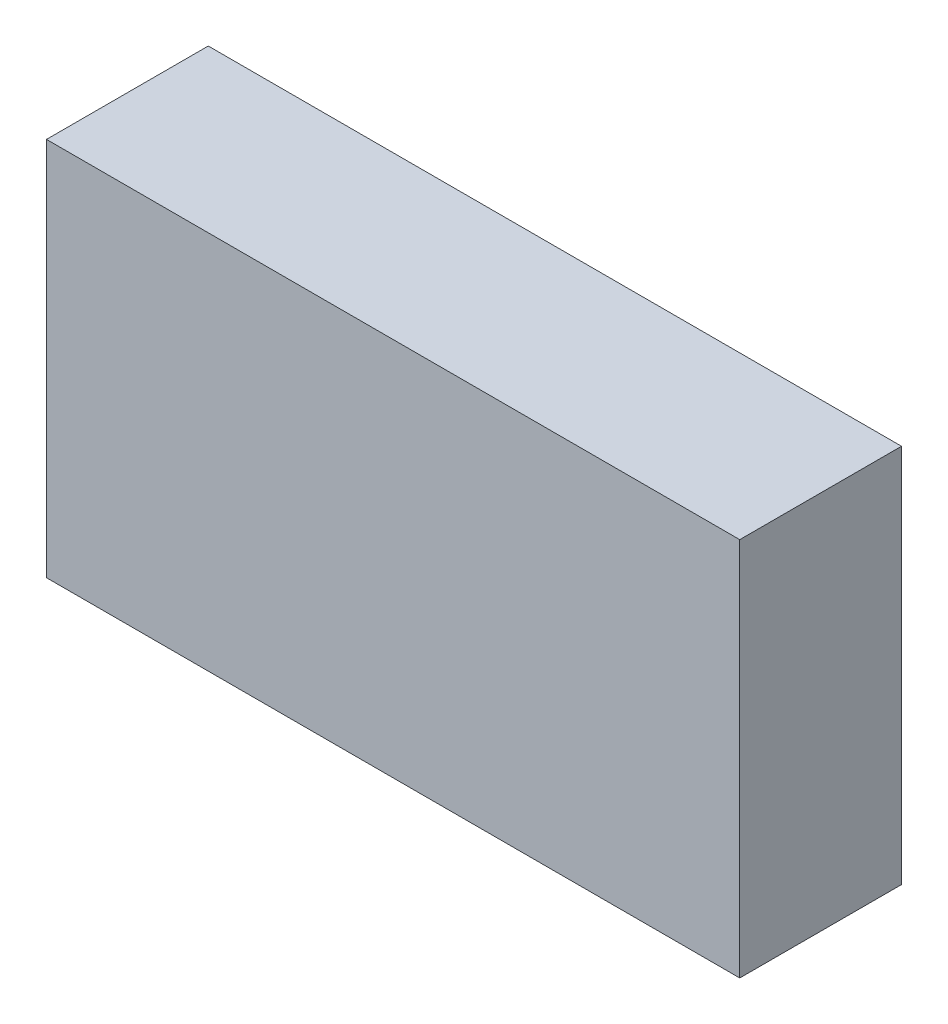
ISO-10303-21;
HEADER;
FILE_DESCRIPTION(('STEP AP214'),'2;1');
FILE_NAME('part.step','',(''),(''),'','','');
FILE_SCHEMA(('AUTOMOTIVE_DESIGN { 1 0 10303 214 1 1 1 1 }'));
ENDSEC;
DATA;
#1=APPLICATION_CONTEXT('core data for automotive mechanical design processes');
#2=APPLICATION_PROTOCOL_DEFINITION('international standard','automotive_design',2000,#1);
#3=PRODUCT_CONTEXT('',#1,'mechanical');
#4=PRODUCT('Part','Part','',(#3));
#5=PRODUCT_RELATED_PRODUCT_CATEGORY('part','',(#4));
#6=PRODUCT_DEFINITION_FORMATION('','',#4);
#7=PRODUCT_DEFINITION_CONTEXT('part definition',#1,'design');
#8=PRODUCT_DEFINITION('design','',#6,#7);
#9=PRODUCT_DEFINITION_SHAPE('','',#8);
#10=(LENGTH_UNIT() NAMED_UNIT(*) SI_UNIT(.MILLI.,.METRE.));
#11=(NAMED_UNIT(*) PLANE_ANGLE_UNIT() SI_UNIT($,.RADIAN.));
#12=(NAMED_UNIT(*) SI_UNIT($,.STERADIAN.) SOLID_ANGLE_UNIT());
#13=UNCERTAINTY_MEASURE_WITH_UNIT(LENGTH_MEASURE(1.E-05),#10,'distance_accuracy_value','');
#14=(GEOMETRIC_REPRESENTATION_CONTEXT(3) GLOBAL_UNCERTAINTY_ASSIGNED_CONTEXT((#13)) GLOBAL_UNIT_ASSIGNED_CONTEXT((#10,
#11,#12)) REPRESENTATION_CONTEXT('',''));
#15=CARTESIAN_POINT('',(0.,0.,0.));
#16=DIRECTION('',(0.,0.,1.));
#17=DIRECTION('',(1.,0.,0.));
#18=AXIS2_PLACEMENT_3D('',#15,#16,#17);
#19=CARTESIAN_POINT('',(105.,-57.5,49.));
#20=DIRECTION('',(-1.,0.,0.));
#21=DIRECTION('',(0.,0.,1.));
#22=AXIS2_PLACEMENT_3D('',#19,#20,#21);
#23=PLANE('',#22);
#24=DIRECTION('',(0.,1.,0.));
#25=VECTOR('',#24,1.);
#26=CARTESIAN_POINT('',(105.,-57.5,0.));
#27=LINE('',#26,#25);
#28=CARTESIAN_POINT('',(105.,-57.5,0.));
#29=VERTEX_POINT('',#28);
#30=CARTESIAN_POINT('',(105.,57.5,0.));
#31=VERTEX_POINT('',#30);
#32=EDGE_CURVE('E97',#29,#31,#27,.T.);
#33=ORIENTED_EDGE('',*,*,#32,.T.);
#34=DIRECTION('',(0.,0.,-1.));
#35=VECTOR('',#34,1.);
#36=CARTESIAN_POINT('',(105.,57.5,49.));
#37=LINE('',#36,#35);
#38=CARTESIAN_POINT('',(105.,57.5,49.));
#39=VERTEX_POINT('',#38);
#40=EDGE_CURVE('E11',#39,#31,#37,.T.);
#41=ORIENTED_EDGE('',*,*,#40,.F.);
#42=DIRECTION('',(0.,1.,0.));
#43=VECTOR('',#42,1.);
#44=CARTESIAN_POINT('',(105.,-57.5,49.));
#45=LINE('',#44,#43);
#46=CARTESIAN_POINT('',(105.,-57.5,49.));
#47=VERTEX_POINT('',#46);
#48=EDGE_CURVE('E85',#47,#39,#45,.T.);
#49=ORIENTED_EDGE('',*,*,#48,.F.);
#50=DIRECTION('',(0.,0.,-1.));
#51=VECTOR('',#50,1.);
#52=CARTESIAN_POINT('',(105.,-57.5,49.));
#53=LINE('',#52,#51);
#54=EDGE_CURVE('E93',#47,#29,#53,.T.);
#55=ORIENTED_EDGE('',*,*,#54,.T.);
#56=EDGE_LOOP('',(#33,#41,#49,#55));
#57=FACE_BOUND('',#56,.T.);
#58=ADVANCED_FACE('F34',(#57),#23,.F.);
#59=CARTESIAN_POINT('',(-105.,57.5,49.));
#60=DIRECTION('',(0.,-1.,0.));
#61=DIRECTION('',(0.,0.,-1.));
#62=AXIS2_PLACEMENT_3D('',#59,#60,#61);
#63=PLANE('',#62);
#64=DIRECTION('',(-1.,0.,0.));
#65=VECTOR('',#64,1.);
#66=CARTESIAN_POINT('',(-105.,57.5,0.));
#67=LINE('',#66,#65);
#68=CARTESIAN_POINT('',(-105.,57.5,0.));
#69=VERTEX_POINT('',#68);
#70=EDGE_CURVE('E89',#31,#69,#67,.T.);
#71=ORIENTED_EDGE('',*,*,#70,.T.);
#72=DIRECTION('',(0.,0.,-1.));
#73=VECTOR('',#72,1.);
#74=CARTESIAN_POINT('',(-105.,57.5,49.));
#75=LINE('',#74,#73);
#76=CARTESIAN_POINT('',(-105.,57.5,49.));
#77=VERTEX_POINT('',#76);
#78=EDGE_CURVE('E42',#77,#69,#75,.T.);
#79=ORIENTED_EDGE('',*,*,#78,.F.);
#80=DIRECTION('',(-1.,0.,0.));
#81=VECTOR('',#80,1.);
#82=CARTESIAN_POINT('',(-105.,57.5,49.));
#83=LINE('',#82,#81);
#84=EDGE_CURVE('E80',#39,#77,#83,.T.);
#85=ORIENTED_EDGE('',*,*,#84,.F.);
#86=ORIENTED_EDGE('',*,*,#40,.T.);
#87=EDGE_LOOP('',(#71,#79,#85,#86));
#88=FACE_BOUND('',#87,.T.);
#89=ADVANCED_FACE('F88',(#88),#63,.F.);
#90=CARTESIAN_POINT('',(-105.,-57.5,49.));
#91=DIRECTION('',(1.,0.,0.));
#92=DIRECTION('',(0.,0.,-1.));
#93=AXIS2_PLACEMENT_3D('',#90,#91,#92);
#94=PLANE('',#93);
#95=DIRECTION('',(0.,-1.,0.));
#96=VECTOR('',#95,1.);
#97=CARTESIAN_POINT('',(-105.,-57.5,0.));
#98=LINE('',#97,#96);
#99=CARTESIAN_POINT('',(-105.,-57.5,0.));
#100=VERTEX_POINT('',#99);
#101=EDGE_CURVE('E67',#69,#100,#98,.T.);
#102=ORIENTED_EDGE('',*,*,#101,.T.);
#103=DIRECTION('',(0.,0.,-1.));
#104=VECTOR('',#103,1.);
#105=CARTESIAN_POINT('',(-105.,-57.5,49.));
#106=LINE('',#105,#104);
#107=CARTESIAN_POINT('',(-105.,-57.5,49.));
#108=VERTEX_POINT('',#107);
#109=EDGE_CURVE('E90',#108,#100,#106,.T.);
#110=ORIENTED_EDGE('',*,*,#109,.F.);
#111=DIRECTION('',(0.,-1.,0.));
#112=VECTOR('',#111,1.);
#113=CARTESIAN_POINT('',(-105.,-57.5,49.));
#114=LINE('',#113,#112);
#115=EDGE_CURVE('E83',#77,#108,#114,.T.);
#116=ORIENTED_EDGE('',*,*,#115,.F.);
#117=ORIENTED_EDGE('',*,*,#78,.T.);
#118=EDGE_LOOP('',(#102,#110,#116,#117));
#119=FACE_BOUND('',#118,.T.);
#120=ADVANCED_FACE('F91',(#119),#94,.F.);
#121=CARTESIAN_POINT('',(-105.,-57.5,49.));
#122=DIRECTION('',(0.,1.,0.));
#123=DIRECTION('',(0.,0.,1.));
#124=AXIS2_PLACEMENT_3D('',#121,#122,#123);
#125=PLANE('',#124);
#126=DIRECTION('',(1.,0.,0.));
#127=VECTOR('',#126,1.);
#128=CARTESIAN_POINT('',(-105.,-57.5,0.));
#129=LINE('',#128,#127);
#130=EDGE_CURVE('E73',#100,#29,#129,.T.);
#131=ORIENTED_EDGE('',*,*,#130,.T.);
#132=ORIENTED_EDGE('',*,*,#54,.F.);
#133=DIRECTION('',(1.,0.,0.));
#134=VECTOR('',#133,1.);
#135=CARTESIAN_POINT('',(-105.,-57.5,49.));
#136=LINE('',#135,#134);
#137=EDGE_CURVE('E50',#108,#47,#136,.T.);
#138=ORIENTED_EDGE('',*,*,#137,.F.);
#139=ORIENTED_EDGE('',*,*,#109,.T.);
#140=EDGE_LOOP('',(#131,#132,#138,#139));
#141=FACE_BOUND('',#140,.T.);
#142=ADVANCED_FACE('F104',(#141),#125,.F.);
#143=CARTESIAN_POINT('',(0.,0.,49.));
#144=DIRECTION('',(0.,0.,-1.));
#145=DIRECTION('',(-1.,0.,0.));
#146=AXIS2_PLACEMENT_3D('',#143,#144,#145);
#147=PLANE('',#146);
#148=ORIENTED_EDGE('',*,*,#48,.T.);
#149=ORIENTED_EDGE('',*,*,#84,.T.);
#150=ORIENTED_EDGE('',*,*,#115,.T.);
#151=ORIENTED_EDGE('',*,*,#137,.T.);
#152=EDGE_LOOP('',(#148,#149,#150,#151));
#153=FACE_BOUND('',#152,.T.);
#154=ADVANCED_FACE('F81',(#153),#147,.F.);
#155=CARTESIAN_POINT('',(0.,0.,0.));
#156=DIRECTION('',(0.,0.,-1.));
#157=DIRECTION('',(-1.,0.,0.));
#158=AXIS2_PLACEMENT_3D('',#155,#156,#157);
#159=PLANE('',#158);
#160=ORIENTED_EDGE('',*,*,#32,.F.);
#161=ORIENTED_EDGE('',*,*,#130,.F.);
#162=ORIENTED_EDGE('',*,*,#101,.F.);
#163=ORIENTED_EDGE('',*,*,#70,.F.);
#164=EDGE_LOOP('',(#160,#161,#162,#163));
#165=FACE_BOUND('',#164,.T.);
#166=ADVANCED_FACE('F107',(#165),#159,.T.);
#167=CLOSED_SHELL('',(#58,#89,#120,#142,#154,#166));
#168=MANIFOLD_SOLID_BREP('B2',#167);
#169=ADVANCED_BREP_SHAPE_REPRESENTATION('',(#18,#168),#14);
#170=SHAPE_DEFINITION_REPRESENTATION(#9,#169);
ENDSEC;
END-ISO-10303-21;
